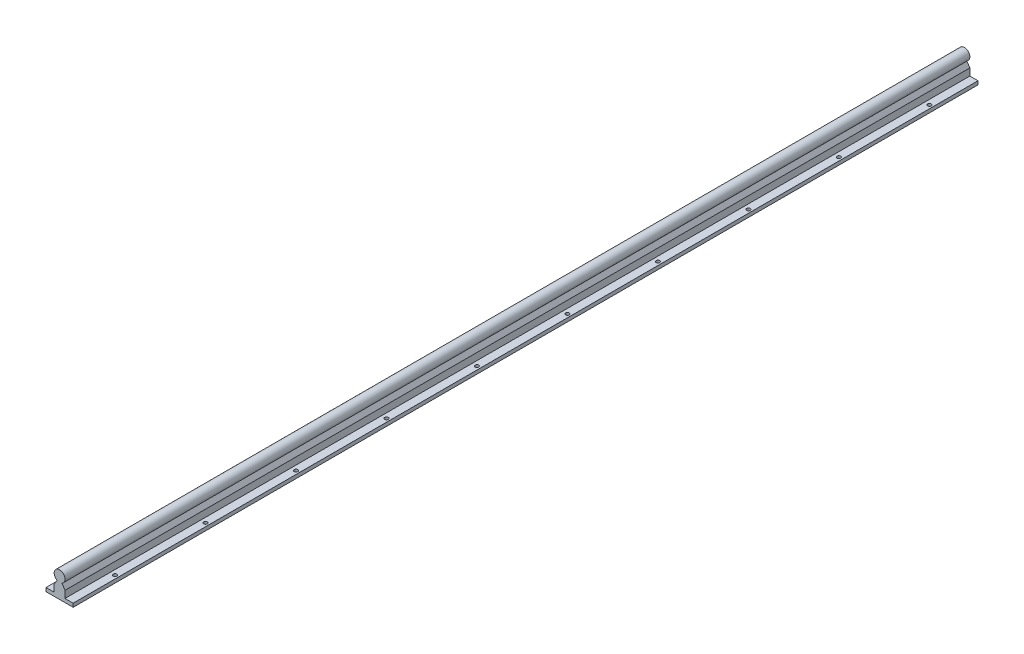
ISO-10303-21;
HEADER;
FILE_DESCRIPTION(('STEP AP214'),'2;1');
FILE_NAME('part.step','',(''),(''),'','','');
FILE_SCHEMA(('AUTOMOTIVE_DESIGN { 1 0 10303 214 1 1 1 1 }'));
ENDSEC;
DATA;
#1=APPLICATION_CONTEXT('core data for automotive mechanical design processes');
#2=APPLICATION_PROTOCOL_DEFINITION('international standard','automotive_design',2000,#1);
#3=PRODUCT_CONTEXT('',#1,'mechanical');
#4=PRODUCT('Part','Part','',(#3));
#5=PRODUCT_RELATED_PRODUCT_CATEGORY('part','',(#4));
#6=PRODUCT_DEFINITION_FORMATION('','',#4);
#7=PRODUCT_DEFINITION_CONTEXT('part definition',#1,'design');
#8=PRODUCT_DEFINITION('design','',#6,#7);
#9=PRODUCT_DEFINITION_SHAPE('','',#8);
#10=(LENGTH_UNIT() NAMED_UNIT(*) SI_UNIT(.MILLI.,.METRE.));
#11=(NAMED_UNIT(*) PLANE_ANGLE_UNIT() SI_UNIT($,.RADIAN.));
#12=(NAMED_UNIT(*) SI_UNIT($,.STERADIAN.) SOLID_ANGLE_UNIT());
#13=UNCERTAINTY_MEASURE_WITH_UNIT(LENGTH_MEASURE(1.E-05),#10,'distance_accuracy_value','');
#14=(GEOMETRIC_REPRESENTATION_CONTEXT(3) GLOBAL_UNCERTAINTY_ASSIGNED_CONTEXT((#13)) GLOBAL_UNIT_ASSIGNED_CONTEXT((#10,
#11,#12)) REPRESENTATION_CONTEXT('',''));
#15=CARTESIAN_POINT('',(0.,0.,0.));
#16=DIRECTION('',(0.,0.,1.));
#17=DIRECTION('',(1.,0.,0.));
#18=AXIS2_PLACEMENT_3D('',#15,#16,#17);
#19=CARTESIAN_POINT('',(19.7074577548358,0.,1000.));
#20=DIRECTION('',(-1.,0.,0.));
#21=DIRECTION('',(0.,-1.,0.));
#22=AXIS2_PLACEMENT_3D('',#19,#20,#21);
#23=PLANE('',#22);
#24=DIRECTION('',(0.,1.,0.));
#25=VECTOR('',#24,1.);
#26=CARTESIAN_POINT('',(19.7074577548358,0.,0.));
#27=LINE('',#26,#25);
#28=CARTESIAN_POINT('',(19.7074577548358,0.,0.));
#29=VERTEX_POINT('',#28);
#30=CARTESIAN_POINT('',(19.7074577548358,4.,0.));
#31=VERTEX_POINT('',#30);
#32=EDGE_CURVE('E140',#29,#31,#27,.T.);
#33=ORIENTED_EDGE('',*,*,#32,.T.);
#34=DIRECTION('',(0.,0.,-1.));
#35=VECTOR('',#34,1.);
#36=CARTESIAN_POINT('',(19.7074577548358,4.,1000.));
#37=LINE('',#36,#35);
#38=CARTESIAN_POINT('',(19.7074577548358,4.,1000.));
#39=VERTEX_POINT('',#38);
#40=EDGE_CURVE('E11',#39,#31,#37,.T.);
#41=ORIENTED_EDGE('',*,*,#40,.F.);
#42=DIRECTION('',(0.,1.,0.));
#43=VECTOR('',#42,1.);
#44=CARTESIAN_POINT('',(19.7074577548358,0.,1000.));
#45=LINE('',#44,#43);
#46=CARTESIAN_POINT('',(19.7074577548358,0.,1000.));
#47=VERTEX_POINT('',#46);
#48=EDGE_CURVE('E159',#47,#39,#45,.T.);
#49=ORIENTED_EDGE('',*,*,#48,.F.);
#50=DIRECTION('',(0.,0.,-1.));
#51=VECTOR('',#50,1.);
#52=CARTESIAN_POINT('',(19.7074577548358,0.,1000.));
#53=LINE('',#52,#51);
#54=EDGE_CURVE('E136',#47,#29,#53,.T.);
#55=ORIENTED_EDGE('',*,*,#54,.T.);
#56=EDGE_LOOP('',(#33,#41,#49,#55));
#57=FACE_BOUND('',#56,.T.);
#58=ADVANCED_FACE('F32',(#57),#23,.F.);
#59=CARTESIAN_POINT('',(19.7074577548358,4.,1000.));
#60=DIRECTION('',(0.,-1.,0.));
#61=DIRECTION('',(1.,0.,0.));
#62=AXIS2_PLACEMENT_3D('',#59,#60,#61);
#63=PLANE('',#62);
#64=CARTESIAN_POINT('',(15.9574577548358,3.99999999999999,950.));
#65=DIRECTION('',(0.,1.,0.));
#66=DIRECTION('',(-1.,0.,0.));
#67=AXIS2_PLACEMENT_3D('',#64,#65,#66);
#68=CIRCLE('',#67,2.);
#69=CARTESIAN_POINT('',(13.9574577548358,3.99999999999999,950.));
#70=VERTEX_POINT('',#69);
#71=EDGE_CURVE('E322',#70,#70,#68,.T.);
#72=ORIENTED_EDGE('',*,*,#71,.F.);
#73=EDGE_LOOP('',(#72));
#74=FACE_BOUND('',#73,.T.);
#75=CARTESIAN_POINT('',(15.9574577548358,3.99999999999999,850.));
#76=DIRECTION('',(0.,1.,0.));
#77=DIRECTION('',(-1.,0.,0.));
#78=AXIS2_PLACEMENT_3D('',#75,#76,#77);
#79=CIRCLE('',#78,2.);
#80=CARTESIAN_POINT('',(13.9574577548358,3.99999999999999,850.));
#81=VERTEX_POINT('',#80);
#82=EDGE_CURVE('E316',#81,#81,#79,.T.);
#83=ORIENTED_EDGE('',*,*,#82,.F.);
#84=EDGE_LOOP('',(#83));
#85=FACE_BOUND('',#84,.T.);
#86=CARTESIAN_POINT('',(15.9574577548358,3.99999999999999,750.));
#87=DIRECTION('',(0.,1.,0.));
#88=DIRECTION('',(-1.,0.,0.));
#89=AXIS2_PLACEMENT_3D('',#86,#87,#88);
#90=CIRCLE('',#89,2.);
#91=CARTESIAN_POINT('',(13.9574577548358,3.99999999999999,750.));
#92=VERTEX_POINT('',#91);
#93=EDGE_CURVE('E310',#92,#92,#90,.T.);
#94=ORIENTED_EDGE('',*,*,#93,.F.);
#95=EDGE_LOOP('',(#94));
#96=FACE_BOUND('',#95,.T.);
#97=CARTESIAN_POINT('',(15.9574577548358,3.99999999999999,650.));
#98=DIRECTION('',(0.,1.,0.));
#99=DIRECTION('',(-1.,0.,0.));
#100=AXIS2_PLACEMENT_3D('',#97,#98,#99);
#101=CIRCLE('',#100,2.);
#102=CARTESIAN_POINT('',(13.9574577548358,3.99999999999999,650.));
#103=VERTEX_POINT('',#102);
#104=EDGE_CURVE('E304',#103,#103,#101,.T.);
#105=ORIENTED_EDGE('',*,*,#104,.F.);
#106=EDGE_LOOP('',(#105));
#107=FACE_BOUND('',#106,.T.);
#108=CARTESIAN_POINT('',(15.9574577548358,3.99999999999999,550.));
#109=DIRECTION('',(0.,1.,0.));
#110=DIRECTION('',(-1.,0.,0.));
#111=AXIS2_PLACEMENT_3D('',#108,#109,#110);
#112=CIRCLE('',#111,2.);
#113=CARTESIAN_POINT('',(13.9574577548358,3.99999999999999,550.));
#114=VERTEX_POINT('',#113);
#115=EDGE_CURVE('E298',#114,#114,#112,.T.);
#116=ORIENTED_EDGE('',*,*,#115,.F.);
#117=EDGE_LOOP('',(#116));
#118=FACE_BOUND('',#117,.T.);
#119=CARTESIAN_POINT('',(15.9574577548358,3.99999999999999,450.));
#120=DIRECTION('',(0.,1.,0.));
#121=DIRECTION('',(-1.,0.,0.));
#122=AXIS2_PLACEMENT_3D('',#119,#120,#121);
#123=CIRCLE('',#122,2.);
#124=CARTESIAN_POINT('',(13.9574577548358,3.99999999999999,450.));
#125=VERTEX_POINT('',#124);
#126=EDGE_CURVE('E292',#125,#125,#123,.T.);
#127=ORIENTED_EDGE('',*,*,#126,.F.);
#128=EDGE_LOOP('',(#127));
#129=FACE_BOUND('',#128,.T.);
#130=CARTESIAN_POINT('',(15.9574577548358,3.99999999999999,350.));
#131=DIRECTION('',(0.,1.,0.));
#132=DIRECTION('',(-1.,0.,0.));
#133=AXIS2_PLACEMENT_3D('',#130,#131,#132);
#134=CIRCLE('',#133,2.);
#135=CARTESIAN_POINT('',(13.9574577548358,3.99999999999999,350.));
#136=VERTEX_POINT('',#135);
#137=EDGE_CURVE('E286',#136,#136,#134,.T.);
#138=ORIENTED_EDGE('',*,*,#137,.F.);
#139=EDGE_LOOP('',(#138));
#140=FACE_BOUND('',#139,.T.);
#141=CARTESIAN_POINT('',(15.9574577548358,3.99999999999999,250.));
#142=DIRECTION('',(0.,1.,0.));
#143=DIRECTION('',(-1.,0.,0.));
#144=AXIS2_PLACEMENT_3D('',#141,#142,#143);
#145=CIRCLE('',#144,2.);
#146=CARTESIAN_POINT('',(13.9574577548358,3.99999999999999,250.));
#147=VERTEX_POINT('',#146);
#148=EDGE_CURVE('E280',#147,#147,#145,.T.);
#149=ORIENTED_EDGE('',*,*,#148,.F.);
#150=EDGE_LOOP('',(#149));
#151=FACE_BOUND('',#150,.T.);
#152=CARTESIAN_POINT('',(15.9574577548358,3.99999999999999,150.));
#153=DIRECTION('',(0.,1.,0.));
#154=DIRECTION('',(-1.,0.,0.));
#155=AXIS2_PLACEMENT_3D('',#152,#153,#154);
#156=CIRCLE('',#155,2.);
#157=CARTESIAN_POINT('',(13.9574577548358,3.99999999999999,150.));
#158=VERTEX_POINT('',#157);
#159=EDGE_CURVE('E274',#158,#158,#156,.T.);
#160=ORIENTED_EDGE('',*,*,#159,.F.);
#161=EDGE_LOOP('',(#160));
#162=FACE_BOUND('',#161,.T.);
#163=CARTESIAN_POINT('',(15.9574577548358,3.99999999999999,50.));
#164=DIRECTION('',(0.,1.,0.));
#165=DIRECTION('',(-1.,0.,0.));
#166=AXIS2_PLACEMENT_3D('',#163,#164,#165);
#167=CIRCLE('',#166,2.);
#168=CARTESIAN_POINT('',(13.9574577548358,3.99999999999999,50.));
#169=VERTEX_POINT('',#168);
#170=EDGE_CURVE('E268',#169,#169,#167,.T.);
#171=ORIENTED_EDGE('',*,*,#170,.F.);
#172=EDGE_LOOP('',(#171));
#173=FACE_BOUND('',#172,.T.);
#174=DIRECTION('',(-1.,0.,0.));
#175=VECTOR('',#174,1.);
#176=CARTESIAN_POINT('',(19.7074577548358,4.,0.));
#177=LINE('',#176,#175);
#178=CARTESIAN_POINT('',(10.7074577548358,4.,0.));
#179=VERTEX_POINT('',#178);
#180=EDGE_CURVE('E143',#31,#179,#177,.T.);
#181=ORIENTED_EDGE('',*,*,#180,.T.);
#182=DIRECTION('',(0.,0.,-1.));
#183=VECTOR('',#182,1.);
#184=CARTESIAN_POINT('',(10.7074577548358,4.,1000.));
#185=LINE('',#184,#183);
#186=CARTESIAN_POINT('',(10.7074577548358,4.,1000.));
#187=VERTEX_POINT('',#186);
#188=EDGE_CURVE('E40',#187,#179,#185,.T.);
#189=ORIENTED_EDGE('',*,*,#188,.F.);
#190=DIRECTION('',(-1.,0.,0.));
#191=VECTOR('',#190,1.);
#192=CARTESIAN_POINT('',(19.7074577548358,4.,1000.));
#193=LINE('',#192,#191);
#194=EDGE_CURVE('E97',#39,#187,#193,.T.);
#195=ORIENTED_EDGE('',*,*,#194,.F.);
#196=ORIENTED_EDGE('',*,*,#40,.T.);
#197=EDGE_LOOP('',(#181,#189,#195,#196));
#198=FACE_BOUND('',#197,.T.);
#199=ADVANCED_FACE('F329',(#74,#85,#96,#107,#118,#129,#140,#151,#162,#173,#198),#63,.F.);
#200=CARTESIAN_POINT('',(10.7074577548358,4.,1000.));
#201=DIRECTION('',(-1.,0.,0.));
#202=DIRECTION('',(0.,0.,1.));
#203=AXIS2_PLACEMENT_3D('',#200,#201,#202);
#204=PLANE('',#203);
#205=DIRECTION('',(0.,1.,0.));
#206=VECTOR('',#205,1.);
#207=CARTESIAN_POINT('',(10.7074577548358,4.,0.));
#208=LINE('',#207,#206);
#209=CARTESIAN_POINT('',(10.7074577548358,11.8,0.));
#210=VERTEX_POINT('',#209);
#211=EDGE_CURVE('E146',#179,#210,#208,.T.);
#212=ORIENTED_EDGE('',*,*,#211,.T.);
#213=DIRECTION('',(0.,0.,-1.));
#214=VECTOR('',#213,1.);
#215=CARTESIAN_POINT('',(10.7074577548358,11.8,1000.));
#216=LINE('',#215,#214);
#217=CARTESIAN_POINT('',(10.7074577548358,11.8,1000.));
#218=VERTEX_POINT('',#217);
#219=EDGE_CURVE('E172',#218,#210,#216,.T.);
#220=ORIENTED_EDGE('',*,*,#219,.F.);
#221=DIRECTION('',(0.,1.,0.));
#222=VECTOR('',#221,1.);
#223=CARTESIAN_POINT('',(10.7074577548358,4.,1000.));
#224=LINE('',#223,#222);
#225=EDGE_CURVE('E180',#187,#218,#224,.T.);
#226=ORIENTED_EDGE('',*,*,#225,.F.);
#227=ORIENTED_EDGE('',*,*,#188,.T.);
#228=EDGE_LOOP('',(#212,#220,#226,#227));
#229=FACE_BOUND('',#228,.T.);
#230=ADVANCED_FACE('F178',(#229),#204,.F.);
#231=CARTESIAN_POINT('',(7.30745775483578,17.,1000.));
#232=DIRECTION('',(-0.836969613973546,-0.547249362982703,0.));
#233=DIRECTION('',(0.547249362982703,-0.836969613973546,0.));
#234=AXIS2_PLACEMENT_3D('',#231,#232,#233);
#235=PLANE('',#234);
#236=DIRECTION('',(-0.547249362982703,0.836969613973546,0.));
#237=VECTOR('',#236,1.);
#238=CARTESIAN_POINT('',(7.30745775483578,17.,0.));
#239=LINE('',#238,#237);
#240=CARTESIAN_POINT('',(7.30745775483578,17.,0.));
#241=VERTEX_POINT('',#240);
#242=EDGE_CURVE('E148',#210,#241,#239,.T.);
#243=ORIENTED_EDGE('',*,*,#242,.T.);
#244=DIRECTION('',(0.,0.,-1.));
#245=VECTOR('',#244,1.);
#246=CARTESIAN_POINT('',(7.30745775483578,17.,1000.));
#247=LINE('',#246,#245);
#248=CARTESIAN_POINT('',(7.30745775483578,17.,1000.));
#249=VERTEX_POINT('',#248);
#250=EDGE_CURVE('E169',#249,#241,#247,.T.);
#251=ORIENTED_EDGE('',*,*,#250,.F.);
#252=DIRECTION('',(-0.547249362982703,0.836969613973546,0.));
#253=VECTOR('',#252,1.);
#254=CARTESIAN_POINT('',(7.30745775483578,17.,1000.));
#255=LINE('',#254,#253);
#256=EDGE_CURVE('E198',#218,#249,#255,.T.);
#257=ORIENTED_EDGE('',*,*,#256,.F.);
#258=ORIENTED_EDGE('',*,*,#219,.T.);
#259=EDGE_LOOP('',(#243,#251,#257,#258));
#260=FACE_BOUND('',#259,.T.);
#261=ADVANCED_FACE('F189',(#260),#235,.F.);
#262=CARTESIAN_POINT('',(4.70745775483578,22.4074023338383,1000.));
#263=DIRECTION('',(0.,0.,-1.));
#264=DIRECTION('',(-1.,0.,0.));
#265=AXIS2_PLACEMENT_3D('',#262,#263,#264);
#266=CYLINDRICAL_SURFACE('',#265,6.);
#267=CARTESIAN_POINT('',(4.70745775483578,22.4074023338383,0.));
#268=DIRECTION('',(0.,0.,1.));
#269=DIRECTION('',(1.,0.,0.));
#270=AXIS2_PLACEMENT_3D('',#267,#268,#269);
#271=CIRCLE('',#270,6.);
#272=CARTESIAN_POINT('',(2.10745775483578,17.,0.));
#273=VERTEX_POINT('',#272);
#274=EDGE_CURVE('E150',#241,#273,#271,.T.);
#275=ORIENTED_EDGE('',*,*,#274,.T.);
#276=DIRECTION('',(0.,0.,-1.));
#277=VECTOR('',#276,1.);
#278=CARTESIAN_POINT('',(2.10745775483578,17.,1000.));
#279=LINE('',#278,#277);
#280=CARTESIAN_POINT('',(2.10745775483578,17.,1000.));
#281=VERTEX_POINT('',#280);
#282=EDGE_CURVE('E166',#281,#273,#279,.T.);
#283=ORIENTED_EDGE('',*,*,#282,.F.);
#284=CARTESIAN_POINT('',(4.70745775483578,22.4074023338383,1000.));
#285=DIRECTION('',(0.,0.,1.));
#286=DIRECTION('',(1.,0.,0.));
#287=AXIS2_PLACEMENT_3D('',#284,#285,#286);
#288=CIRCLE('',#287,6.);
#289=EDGE_CURVE('E195',#249,#281,#288,.T.);
#290=ORIENTED_EDGE('',*,*,#289,.F.);
#291=ORIENTED_EDGE('',*,*,#250,.T.);
#292=EDGE_LOOP('',(#275,#283,#290,#291));
#293=FACE_BOUND('',#292,.T.);
#294=ADVANCED_FACE('F193',(#293),#266,.T.);
#295=CARTESIAN_POINT('',(-1.29254224516422,11.8,1000.));
#296=DIRECTION('',(0.836969613973546,-0.547249362982703,0.));
#297=DIRECTION('',(0.547249362982703,0.836969613973546,0.));
#298=AXIS2_PLACEMENT_3D('',#295,#296,#297);
#299=PLANE('',#298);
#300=DIRECTION('',(-0.547249362982703,-0.836969613973546,0.));
#301=VECTOR('',#300,1.);
#302=CARTESIAN_POINT('',(-1.29254224516422,11.8,0.));
#303=LINE('',#302,#301);
#304=CARTESIAN_POINT('',(-1.29254224516422,11.8,0.));
#305=VERTEX_POINT('',#304);
#306=EDGE_CURVE('E152',#273,#305,#303,.T.);
#307=ORIENTED_EDGE('',*,*,#306,.T.);
#308=DIRECTION('',(0.,0.,-1.));
#309=VECTOR('',#308,1.);
#310=CARTESIAN_POINT('',(-1.29254224516422,11.8,1000.));
#311=LINE('',#310,#309);
#312=CARTESIAN_POINT('',(-1.29254224516422,11.8,1000.));
#313=VERTEX_POINT('',#312);
#314=EDGE_CURVE('E163',#313,#305,#311,.T.);
#315=ORIENTED_EDGE('',*,*,#314,.F.);
#316=DIRECTION('',(-0.547249362982703,-0.836969613973546,0.));
#317=VECTOR('',#316,1.);
#318=CARTESIAN_POINT('',(-1.29254224516422,11.8,1000.));
#319=LINE('',#318,#317);
#320=EDGE_CURVE('E197',#281,#313,#319,.T.);
#321=ORIENTED_EDGE('',*,*,#320,.F.);
#322=ORIENTED_EDGE('',*,*,#282,.T.);
#323=EDGE_LOOP('',(#307,#315,#321,#322));
#324=FACE_BOUND('',#323,.T.);
#325=ADVANCED_FACE('F357',(#324),#299,.F.);
#326=CARTESIAN_POINT('',(-1.29254224516422,4.,1000.));
#327=DIRECTION('',(1.,0.,0.));
#328=DIRECTION('',(0.,0.,-1.));
#329=AXIS2_PLACEMENT_3D('',#326,#327,#328);
#330=PLANE('',#329);
#331=DIRECTION('',(0.,-1.,0.));
#332=VECTOR('',#331,1.);
#333=CARTESIAN_POINT('',(-1.29254224516422,4.,0.));
#334=LINE('',#333,#332);
#335=CARTESIAN_POINT('',(-1.29254224516422,4.,0.));
#336=VERTEX_POINT('',#335);
#337=EDGE_CURVE('E154',#305,#336,#334,.T.);
#338=ORIENTED_EDGE('',*,*,#337,.T.);
#339=DIRECTION('',(0.,0.,-1.));
#340=VECTOR('',#339,1.);
#341=CARTESIAN_POINT('',(-1.29254224516422,4.,1000.));
#342=LINE('',#341,#340);
#343=CARTESIAN_POINT('',(-1.29254224516422,4.,1000.));
#344=VERTEX_POINT('',#343);
#345=EDGE_CURVE('E131',#344,#336,#342,.T.);
#346=ORIENTED_EDGE('',*,*,#345,.F.);
#347=DIRECTION('',(0.,-1.,0.));
#348=VECTOR('',#347,1.);
#349=CARTESIAN_POINT('',(-1.29254224516422,4.,1000.));
#350=LINE('',#349,#348);
#351=EDGE_CURVE('E122',#313,#344,#350,.T.);
#352=ORIENTED_EDGE('',*,*,#351,.F.);
#353=ORIENTED_EDGE('',*,*,#314,.T.);
#354=EDGE_LOOP('',(#338,#346,#352,#353));
#355=FACE_BOUND('',#354,.T.);
#356=ADVANCED_FACE('F354',(#355),#330,.F.);
#357=CARTESIAN_POINT('',(-10.2925422451642,4.,1000.));
#358=DIRECTION('',(0.,-1.,0.));
#359=DIRECTION('',(1.,0.,0.));
#360=AXIS2_PLACEMENT_3D('',#357,#358,#359);
#361=PLANE('',#360);
#362=CARTESIAN_POINT('',(-6.54254224516422,4.,950.));
#363=DIRECTION('',(0.,1.,0.));
#364=DIRECTION('',(-1.,0.,0.));
#365=AXIS2_PLACEMENT_3D('',#362,#363,#364);
#366=CIRCLE('',#365,2.);
#367=CARTESIAN_POINT('',(-8.54254224516422,4.,950.));
#368=VERTEX_POINT('',#367);
#369=EDGE_CURVE('E262',#368,#368,#366,.T.);
#370=ORIENTED_EDGE('',*,*,#369,.F.);
#371=EDGE_LOOP('',(#370));
#372=FACE_BOUND('',#371,.T.);
#373=CARTESIAN_POINT('',(-6.54254224516422,4.,850.));
#374=DIRECTION('',(0.,1.,0.));
#375=DIRECTION('',(-1.,0.,0.));
#376=AXIS2_PLACEMENT_3D('',#373,#374,#375);
#377=CIRCLE('',#376,2.);
#378=CARTESIAN_POINT('',(-8.54254224516422,4.,850.));
#379=VERTEX_POINT('',#378);
#380=EDGE_CURVE('E256',#379,#379,#377,.T.);
#381=ORIENTED_EDGE('',*,*,#380,.F.);
#382=EDGE_LOOP('',(#381));
#383=FACE_BOUND('',#382,.T.);
#384=CARTESIAN_POINT('',(-6.54254224516422,4.,750.));
#385=DIRECTION('',(0.,1.,0.));
#386=DIRECTION('',(-1.,0.,0.));
#387=AXIS2_PLACEMENT_3D('',#384,#385,#386);
#388=CIRCLE('',#387,2.);
#389=CARTESIAN_POINT('',(-8.54254224516422,4.,750.));
#390=VERTEX_POINT('',#389);
#391=EDGE_CURVE('E250',#390,#390,#388,.T.);
#392=ORIENTED_EDGE('',*,*,#391,.F.);
#393=EDGE_LOOP('',(#392));
#394=FACE_BOUND('',#393,.T.);
#395=CARTESIAN_POINT('',(-6.54254224516422,4.,650.));
#396=DIRECTION('',(0.,1.,0.));
#397=DIRECTION('',(-1.,0.,0.));
#398=AXIS2_PLACEMENT_3D('',#395,#396,#397);
#399=CIRCLE('',#398,2.);
#400=CARTESIAN_POINT('',(-8.54254224516422,4.,650.));
#401=VERTEX_POINT('',#400);
#402=EDGE_CURVE('E244',#401,#401,#399,.T.);
#403=ORIENTED_EDGE('',*,*,#402,.F.);
#404=EDGE_LOOP('',(#403));
#405=FACE_BOUND('',#404,.T.);
#406=CARTESIAN_POINT('',(-6.54254224516422,4.,550.));
#407=DIRECTION('',(0.,1.,0.));
#408=DIRECTION('',(-1.,0.,0.));
#409=AXIS2_PLACEMENT_3D('',#406,#407,#408);
#410=CIRCLE('',#409,2.);
#411=CARTESIAN_POINT('',(-8.54254224516422,4.,550.));
#412=VERTEX_POINT('',#411);
#413=EDGE_CURVE('E238',#412,#412,#410,.T.);
#414=ORIENTED_EDGE('',*,*,#413,.F.);
#415=EDGE_LOOP('',(#414));
#416=FACE_BOUND('',#415,.T.);
#417=CARTESIAN_POINT('',(-6.54254224516422,4.,450.));
#418=DIRECTION('',(0.,1.,0.));
#419=DIRECTION('',(-1.,0.,0.));
#420=AXIS2_PLACEMENT_3D('',#417,#418,#419);
#421=CIRCLE('',#420,2.);
#422=CARTESIAN_POINT('',(-8.54254224516422,4.,450.));
#423=VERTEX_POINT('',#422);
#424=EDGE_CURVE('E232',#423,#423,#421,.T.);
#425=ORIENTED_EDGE('',*,*,#424,.F.);
#426=EDGE_LOOP('',(#425));
#427=FACE_BOUND('',#426,.T.);
#428=CARTESIAN_POINT('',(-6.54254224516422,4.,350.));
#429=DIRECTION('',(0.,1.,0.));
#430=DIRECTION('',(-1.,0.,0.));
#431=AXIS2_PLACEMENT_3D('',#428,#429,#430);
#432=CIRCLE('',#431,2.);
#433=CARTESIAN_POINT('',(-8.54254224516422,4.,350.));
#434=VERTEX_POINT('',#433);
#435=EDGE_CURVE('E226',#434,#434,#432,.T.);
#436=ORIENTED_EDGE('',*,*,#435,.F.);
#437=EDGE_LOOP('',(#436));
#438=FACE_BOUND('',#437,.T.);
#439=CARTESIAN_POINT('',(-6.54254224516422,4.,250.));
#440=DIRECTION('',(0.,1.,0.));
#441=DIRECTION('',(-1.,0.,0.));
#442=AXIS2_PLACEMENT_3D('',#439,#440,#441);
#443=CIRCLE('',#442,2.);
#444=CARTESIAN_POINT('',(-8.54254224516422,4.,250.));
#445=VERTEX_POINT('',#444);
#446=EDGE_CURVE('E220',#445,#445,#443,.T.);
#447=ORIENTED_EDGE('',*,*,#446,.F.);
#448=EDGE_LOOP('',(#447));
#449=FACE_BOUND('',#448,.T.);
#450=CARTESIAN_POINT('',(-6.54254224516422,4.,150.));
#451=DIRECTION('',(0.,1.,0.));
#452=DIRECTION('',(-1.,0.,0.));
#453=AXIS2_PLACEMENT_3D('',#450,#451,#452);
#454=CIRCLE('',#453,2.);
#455=CARTESIAN_POINT('',(-8.54254224516422,4.,150.));
#456=VERTEX_POINT('',#455);
#457=EDGE_CURVE('E214',#456,#456,#454,.T.);
#458=ORIENTED_EDGE('',*,*,#457,.F.);
#459=EDGE_LOOP('',(#458));
#460=FACE_BOUND('',#459,.T.);
#461=CARTESIAN_POINT('',(-6.54254224516422,4.,50.));
#462=DIRECTION('',(0.,1.,0.));
#463=DIRECTION('',(-1.,0.,0.));
#464=AXIS2_PLACEMENT_3D('',#461,#462,#463);
#465=CIRCLE('',#464,2.);
#466=CARTESIAN_POINT('',(-8.54254224516422,4.,50.));
#467=VERTEX_POINT('',#466);
#468=EDGE_CURVE('E208',#467,#467,#465,.T.);
#469=ORIENTED_EDGE('',*,*,#468,.F.);
#470=EDGE_LOOP('',(#469));
#471=FACE_BOUND('',#470,.T.);
#472=DIRECTION('',(-1.,0.,0.));
#473=VECTOR('',#472,1.);
#474=CARTESIAN_POINT('',(-10.2925422451642,4.,0.));
#475=LINE('',#474,#473);
#476=CARTESIAN_POINT('',(-10.2925422451642,4.,0.));
#477=VERTEX_POINT('',#476);
#478=EDGE_CURVE('E130',#336,#477,#475,.T.);
#479=ORIENTED_EDGE('',*,*,#478,.T.);
#480=DIRECTION('',(0.,0.,-1.));
#481=VECTOR('',#480,1.);
#482=CARTESIAN_POINT('',(-10.2925422451642,4.,1000.));
#483=LINE('',#482,#481);
#484=CARTESIAN_POINT('',(-10.2925422451642,4.,1000.));
#485=VERTEX_POINT('',#484);
#486=EDGE_CURVE('E127',#485,#477,#483,.T.);
#487=ORIENTED_EDGE('',*,*,#486,.F.);
#488=DIRECTION('',(-1.,0.,0.));
#489=VECTOR('',#488,1.);
#490=CARTESIAN_POINT('',(-10.2925422451642,4.,1000.));
#491=LINE('',#490,#489);
#492=EDGE_CURVE('E116',#344,#485,#491,.T.);
#493=ORIENTED_EDGE('',*,*,#492,.F.);
#494=ORIENTED_EDGE('',*,*,#345,.T.);
#495=EDGE_LOOP('',(#479,#487,#493,#494));
#496=FACE_BOUND('',#495,.T.);
#497=ADVANCED_FACE('F128',(#372,#383,#394,#405,#416,#427,#438,#449,#460,#471,#496),#361,.F.);
#498=CARTESIAN_POINT('',(-10.2925422451642,0.,1000.));
#499=DIRECTION('',(1.,0.,0.));
#500=DIRECTION('',(0.,1.,0.));
#501=AXIS2_PLACEMENT_3D('',#498,#499,#500);
#502=PLANE('',#501);
#503=DIRECTION('',(0.,-1.,0.));
#504=VECTOR('',#503,1.);
#505=CARTESIAN_POINT('',(-10.2925422451642,0.,0.));
#506=LINE('',#505,#504);
#507=CARTESIAN_POINT('',(-10.2925422451642,0.,0.));
#508=VERTEX_POINT('',#507);
#509=EDGE_CURVE('E83',#477,#508,#506,.T.);
#510=ORIENTED_EDGE('',*,*,#509,.T.);
#511=DIRECTION('',(0.,0.,-1.));
#512=VECTOR('',#511,1.);
#513=CARTESIAN_POINT('',(-10.2925422451642,0.,1000.));
#514=LINE('',#513,#512);
#515=CARTESIAN_POINT('',(-10.2925422451642,0.,1000.));
#516=VERTEX_POINT('',#515);
#517=EDGE_CURVE('E132',#516,#508,#514,.T.);
#518=ORIENTED_EDGE('',*,*,#517,.F.);
#519=DIRECTION('',(0.,-1.,0.));
#520=VECTOR('',#519,1.);
#521=CARTESIAN_POINT('',(-10.2925422451642,0.,1000.));
#522=LINE('',#521,#520);
#523=EDGE_CURVE('E120',#485,#516,#522,.T.);
#524=ORIENTED_EDGE('',*,*,#523,.F.);
#525=ORIENTED_EDGE('',*,*,#486,.T.);
#526=EDGE_LOOP('',(#510,#518,#524,#525));
#527=FACE_BOUND('',#526,.T.);
#528=ADVANCED_FACE('F134',(#527),#502,.F.);
#529=CARTESIAN_POINT('',(19.7074577548358,0.,1000.));
#530=DIRECTION('',(0.,1.,0.));
#531=DIRECTION('',(0.,0.,1.));
#532=AXIS2_PLACEMENT_3D('',#529,#530,#531);
#533=PLANE('',#532);
#534=CARTESIAN_POINT('',(15.9574577548358,0.,950.));
#535=DIRECTION('',(0.,1.,0.));
#536=DIRECTION('',(0.,0.,1.));
#537=AXIS2_PLACEMENT_3D('',#534,#535,#536);
#538=CIRCLE('',#537,2.);
#539=CARTESIAN_POINT('',(15.9574577548358,0.,952.));
#540=VERTEX_POINT('',#539);
#541=EDGE_CURVE('E319',#540,#540,#538,.F.);
#542=ORIENTED_EDGE('',*,*,#541,.F.);
#543=EDGE_LOOP('',(#542));
#544=FACE_BOUND('',#543,.T.);
#545=CARTESIAN_POINT('',(15.9574577548358,0.,850.));
#546=DIRECTION('',(0.,1.,0.));
#547=DIRECTION('',(0.,0.,1.));
#548=AXIS2_PLACEMENT_3D('',#545,#546,#547);
#549=CIRCLE('',#548,2.);
#550=CARTESIAN_POINT('',(15.9574577548358,0.,852.));
#551=VERTEX_POINT('',#550);
#552=EDGE_CURVE('E313',#551,#551,#549,.F.);
#553=ORIENTED_EDGE('',*,*,#552,.F.);
#554=EDGE_LOOP('',(#553));
#555=FACE_BOUND('',#554,.T.);
#556=CARTESIAN_POINT('',(15.9574577548358,0.,750.));
#557=DIRECTION('',(0.,1.,0.));
#558=DIRECTION('',(0.,0.,1.));
#559=AXIS2_PLACEMENT_3D('',#556,#557,#558);
#560=CIRCLE('',#559,2.);
#561=CARTESIAN_POINT('',(15.9574577548358,0.,752.));
#562=VERTEX_POINT('',#561);
#563=EDGE_CURVE('E307',#562,#562,#560,.F.);
#564=ORIENTED_EDGE('',*,*,#563,.F.);
#565=EDGE_LOOP('',(#564));
#566=FACE_BOUND('',#565,.T.);
#567=CARTESIAN_POINT('',(15.9574577548358,0.,650.));
#568=DIRECTION('',(0.,1.,0.));
#569=DIRECTION('',(0.,0.,1.));
#570=AXIS2_PLACEMENT_3D('',#567,#568,#569);
#571=CIRCLE('',#570,2.);
#572=CARTESIAN_POINT('',(15.9574577548358,0.,652.));
#573=VERTEX_POINT('',#572);
#574=EDGE_CURVE('E301',#573,#573,#571,.F.);
#575=ORIENTED_EDGE('',*,*,#574,.F.);
#576=EDGE_LOOP('',(#575));
#577=FACE_BOUND('',#576,.T.);
#578=CARTESIAN_POINT('',(15.9574577548358,0.,550.));
#579=DIRECTION('',(0.,1.,0.));
#580=DIRECTION('',(0.,0.,1.));
#581=AXIS2_PLACEMENT_3D('',#578,#579,#580);
#582=CIRCLE('',#581,2.);
#583=CARTESIAN_POINT('',(15.9574577548358,0.,552.));
#584=VERTEX_POINT('',#583);
#585=EDGE_CURVE('E295',#584,#584,#582,.F.);
#586=ORIENTED_EDGE('',*,*,#585,.F.);
#587=EDGE_LOOP('',(#586));
#588=FACE_BOUND('',#587,.T.);
#589=CARTESIAN_POINT('',(15.9574577548358,0.,450.));
#590=DIRECTION('',(0.,1.,0.));
#591=DIRECTION('',(0.,0.,1.));
#592=AXIS2_PLACEMENT_3D('',#589,#590,#591);
#593=CIRCLE('',#592,2.);
#594=CARTESIAN_POINT('',(15.9574577548358,0.,452.));
#595=VERTEX_POINT('',#594);
#596=EDGE_CURVE('E289',#595,#595,#593,.F.);
#597=ORIENTED_EDGE('',*,*,#596,.F.);
#598=EDGE_LOOP('',(#597));
#599=FACE_BOUND('',#598,.T.);
#600=CARTESIAN_POINT('',(15.9574577548358,0.,350.));
#601=DIRECTION('',(0.,1.,0.));
#602=DIRECTION('',(0.,0.,1.));
#603=AXIS2_PLACEMENT_3D('',#600,#601,#602);
#604=CIRCLE('',#603,2.);
#605=CARTESIAN_POINT('',(15.9574577548358,0.,352.));
#606=VERTEX_POINT('',#605);
#607=EDGE_CURVE('E283',#606,#606,#604,.F.);
#608=ORIENTED_EDGE('',*,*,#607,.F.);
#609=EDGE_LOOP('',(#608));
#610=FACE_BOUND('',#609,.T.);
#611=CARTESIAN_POINT('',(15.9574577548358,0.,250.));
#612=DIRECTION('',(0.,1.,0.));
#613=DIRECTION('',(0.,0.,1.));
#614=AXIS2_PLACEMENT_3D('',#611,#612,#613);
#615=CIRCLE('',#614,2.);
#616=CARTESIAN_POINT('',(15.9574577548358,0.,252.));
#617=VERTEX_POINT('',#616);
#618=EDGE_CURVE('E277',#617,#617,#615,.F.);
#619=ORIENTED_EDGE('',*,*,#618,.F.);
#620=EDGE_LOOP('',(#619));
#621=FACE_BOUND('',#620,.T.);
#622=CARTESIAN_POINT('',(15.9574577548358,0.,150.));
#623=DIRECTION('',(0.,1.,0.));
#624=DIRECTION('',(0.,0.,1.));
#625=AXIS2_PLACEMENT_3D('',#622,#623,#624);
#626=CIRCLE('',#625,2.);
#627=CARTESIAN_POINT('',(15.9574577548358,0.,152.));
#628=VERTEX_POINT('',#627);
#629=EDGE_CURVE('E271',#628,#628,#626,.F.);
#630=ORIENTED_EDGE('',*,*,#629,.F.);
#631=EDGE_LOOP('',(#630));
#632=FACE_BOUND('',#631,.T.);
#633=CARTESIAN_POINT('',(15.9574577548358,0.,50.));
#634=DIRECTION('',(0.,1.,0.));
#635=DIRECTION('',(0.,0.,1.));
#636=AXIS2_PLACEMENT_3D('',#633,#634,#635);
#637=CIRCLE('',#636,2.);
#638=CARTESIAN_POINT('',(15.9574577548358,0.,52.));
#639=VERTEX_POINT('',#638);
#640=EDGE_CURVE('E265',#639,#639,#637,.F.);
#641=ORIENTED_EDGE('',*,*,#640,.F.);
#642=EDGE_LOOP('',(#641));
#643=FACE_BOUND('',#642,.T.);
#644=CARTESIAN_POINT('',(-6.54254224516422,0.,950.));
#645=DIRECTION('',(0.,1.,0.));
#646=DIRECTION('',(0.,0.,1.));
#647=AXIS2_PLACEMENT_3D('',#644,#645,#646);
#648=CIRCLE('',#647,2.);
#649=CARTESIAN_POINT('',(-6.54254224516422,0.,952.));
#650=VERTEX_POINT('',#649);
#651=EDGE_CURVE('E259',#650,#650,#648,.F.);
#652=ORIENTED_EDGE('',*,*,#651,.F.);
#653=EDGE_LOOP('',(#652));
#654=FACE_BOUND('',#653,.T.);
#655=CARTESIAN_POINT('',(-6.54254224516422,0.,850.));
#656=DIRECTION('',(0.,1.,0.));
#657=DIRECTION('',(0.,0.,1.));
#658=AXIS2_PLACEMENT_3D('',#655,#656,#657);
#659=CIRCLE('',#658,2.);
#660=CARTESIAN_POINT('',(-6.54254224516422,0.,852.));
#661=VERTEX_POINT('',#660);
#662=EDGE_CURVE('E253',#661,#661,#659,.F.);
#663=ORIENTED_EDGE('',*,*,#662,.F.);
#664=EDGE_LOOP('',(#663));
#665=FACE_BOUND('',#664,.T.);
#666=CARTESIAN_POINT('',(-6.54254224516422,0.,750.));
#667=DIRECTION('',(0.,1.,0.));
#668=DIRECTION('',(0.,0.,1.));
#669=AXIS2_PLACEMENT_3D('',#666,#667,#668);
#670=CIRCLE('',#669,2.);
#671=CARTESIAN_POINT('',(-6.54254224516422,0.,752.));
#672=VERTEX_POINT('',#671);
#673=EDGE_CURVE('E247',#672,#672,#670,.F.);
#674=ORIENTED_EDGE('',*,*,#673,.F.);
#675=EDGE_LOOP('',(#674));
#676=FACE_BOUND('',#675,.T.);
#677=CARTESIAN_POINT('',(-6.54254224516422,0.,650.));
#678=DIRECTION('',(0.,1.,0.));
#679=DIRECTION('',(0.,0.,1.));
#680=AXIS2_PLACEMENT_3D('',#677,#678,#679);
#681=CIRCLE('',#680,2.);
#682=CARTESIAN_POINT('',(-6.54254224516422,0.,652.));
#683=VERTEX_POINT('',#682);
#684=EDGE_CURVE('E241',#683,#683,#681,.F.);
#685=ORIENTED_EDGE('',*,*,#684,.F.);
#686=EDGE_LOOP('',(#685));
#687=FACE_BOUND('',#686,.T.);
#688=CARTESIAN_POINT('',(-6.54254224516422,0.,550.));
#689=DIRECTION('',(0.,1.,0.));
#690=DIRECTION('',(0.,0.,1.));
#691=AXIS2_PLACEMENT_3D('',#688,#689,#690);
#692=CIRCLE('',#691,2.);
#693=CARTESIAN_POINT('',(-6.54254224516422,0.,552.));
#694=VERTEX_POINT('',#693);
#695=EDGE_CURVE('E235',#694,#694,#692,.F.);
#696=ORIENTED_EDGE('',*,*,#695,.F.);
#697=EDGE_LOOP('',(#696));
#698=FACE_BOUND('',#697,.T.);
#699=CARTESIAN_POINT('',(-6.54254224516422,0.,450.));
#700=DIRECTION('',(0.,1.,0.));
#701=DIRECTION('',(0.,0.,1.));
#702=AXIS2_PLACEMENT_3D('',#699,#700,#701);
#703=CIRCLE('',#702,2.);
#704=CARTESIAN_POINT('',(-6.54254224516422,0.,452.));
#705=VERTEX_POINT('',#704);
#706=EDGE_CURVE('E229',#705,#705,#703,.F.);
#707=ORIENTED_EDGE('',*,*,#706,.F.);
#708=EDGE_LOOP('',(#707));
#709=FACE_BOUND('',#708,.T.);
#710=CARTESIAN_POINT('',(-6.54254224516422,0.,350.));
#711=DIRECTION('',(0.,1.,0.));
#712=DIRECTION('',(0.,0.,1.));
#713=AXIS2_PLACEMENT_3D('',#710,#711,#712);
#714=CIRCLE('',#713,2.);
#715=CARTESIAN_POINT('',(-6.54254224516422,0.,352.));
#716=VERTEX_POINT('',#715);
#717=EDGE_CURVE('E223',#716,#716,#714,.F.);
#718=ORIENTED_EDGE('',*,*,#717,.F.);
#719=EDGE_LOOP('',(#718));
#720=FACE_BOUND('',#719,.T.);
#721=CARTESIAN_POINT('',(-6.54254224516422,0.,250.));
#722=DIRECTION('',(0.,1.,0.));
#723=DIRECTION('',(0.,0.,1.));
#724=AXIS2_PLACEMENT_3D('',#721,#722,#723);
#725=CIRCLE('',#724,2.);
#726=CARTESIAN_POINT('',(-6.54254224516422,0.,252.));
#727=VERTEX_POINT('',#726);
#728=EDGE_CURVE('E217',#727,#727,#725,.F.);
#729=ORIENTED_EDGE('',*,*,#728,.F.);
#730=EDGE_LOOP('',(#729));
#731=FACE_BOUND('',#730,.T.);
#732=CARTESIAN_POINT('',(-6.54254224516422,0.,150.));
#733=DIRECTION('',(0.,1.,0.));
#734=DIRECTION('',(0.,0.,1.));
#735=AXIS2_PLACEMENT_3D('',#732,#733,#734);
#736=CIRCLE('',#735,2.);
#737=CARTESIAN_POINT('',(-6.54254224516422,0.,152.));
#738=VERTEX_POINT('',#737);
#739=EDGE_CURVE('E211',#738,#738,#736,.F.);
#740=ORIENTED_EDGE('',*,*,#739,.F.);
#741=EDGE_LOOP('',(#740));
#742=FACE_BOUND('',#741,.T.);
#743=CARTESIAN_POINT('',(-6.54254224516422,0.,50.));
#744=DIRECTION('',(0.,1.,0.));
#745=DIRECTION('',(0.,0.,1.));
#746=AXIS2_PLACEMENT_3D('',#743,#744,#745);
#747=CIRCLE('',#746,2.);
#748=CARTESIAN_POINT('',(-6.54254224516422,0.,52.));
#749=VERTEX_POINT('',#748);
#750=EDGE_CURVE('E144',#749,#749,#747,.F.);
#751=ORIENTED_EDGE('',*,*,#750,.F.);
#752=EDGE_LOOP('',(#751));
#753=FACE_BOUND('',#752,.T.);
#754=DIRECTION('',(1.,0.,0.));
#755=VECTOR('',#754,1.);
#756=CARTESIAN_POINT('',(19.7074577548358,0.,0.));
#757=LINE('',#756,#755);
#758=EDGE_CURVE('E89',#508,#29,#757,.T.);
#759=ORIENTED_EDGE('',*,*,#758,.T.);
#760=ORIENTED_EDGE('',*,*,#54,.F.);
#761=DIRECTION('',(1.,0.,0.));
#762=VECTOR('',#761,1.);
#763=CARTESIAN_POINT('',(19.7074577548358,0.,1000.));
#764=LINE('',#763,#762);
#765=EDGE_CURVE('E48',#516,#47,#764,.T.);
#766=ORIENTED_EDGE('',*,*,#765,.F.);
#767=ORIENTED_EDGE('',*,*,#517,.T.);
#768=EDGE_LOOP('',(#759,#760,#766,#767));
#769=FACE_BOUND('',#768,.T.);
#770=ADVANCED_FACE('F414',(#544,#555,#566,#577,#588,#599,#610,#621,#632,#643,#654,#665,#676,
#687,#698,#709,#720,#731,#742,#753,#769),#533,.F.);
#771=CARTESIAN_POINT('',(4.70745775483578,22.4074023338383,1000.));
#772=DIRECTION('',(0.,0.,1.));
#773=DIRECTION('',(1.,0.,0.));
#774=AXIS2_PLACEMENT_3D('',#771,#772,#773);
#775=PLANE('',#774);
#776=ORIENTED_EDGE('',*,*,#48,.T.);
#777=ORIENTED_EDGE('',*,*,#194,.T.);
#778=ORIENTED_EDGE('',*,*,#225,.T.);
#779=ORIENTED_EDGE('',*,*,#256,.T.);
#780=ORIENTED_EDGE('',*,*,#289,.T.);
#781=ORIENTED_EDGE('',*,*,#320,.T.);
#782=ORIENTED_EDGE('',*,*,#351,.T.);
#783=ORIENTED_EDGE('',*,*,#492,.T.);
#784=ORIENTED_EDGE('',*,*,#523,.T.);
#785=ORIENTED_EDGE('',*,*,#765,.T.);
#786=EDGE_LOOP('',(#776,#777,#778,#779,#780,#781,#782,#783,#784,#785));
#787=FACE_BOUND('',#786,.T.);
#788=ADVANCED_FACE('F118',(#787),#775,.T.);
#789=CARTESIAN_POINT('',(4.70745775483578,22.4074023338383,0.));
#790=DIRECTION('',(0.,0.,1.));
#791=DIRECTION('',(1.,0.,0.));
#792=AXIS2_PLACEMENT_3D('',#789,#790,#791);
#793=PLANE('',#792);
#794=ORIENTED_EDGE('',*,*,#32,.F.);
#795=ORIENTED_EDGE('',*,*,#758,.F.);
#796=ORIENTED_EDGE('',*,*,#509,.F.);
#797=ORIENTED_EDGE('',*,*,#478,.F.);
#798=ORIENTED_EDGE('',*,*,#337,.F.);
#799=ORIENTED_EDGE('',*,*,#306,.F.);
#800=ORIENTED_EDGE('',*,*,#274,.F.);
#801=ORIENTED_EDGE('',*,*,#242,.F.);
#802=ORIENTED_EDGE('',*,*,#211,.F.);
#803=ORIENTED_EDGE('',*,*,#180,.F.);
#804=EDGE_LOOP('',(#794,#795,#796,#797,#798,#799,#800,#801,#802,#803));
#805=FACE_BOUND('',#804,.T.);
#806=ADVANCED_FACE('F184',(#805),#793,.F.);
#807=CARTESIAN_POINT('',(-6.54254224516422,-0.0010000000000036,50.));
#808=DIRECTION('',(0.,1.,0.));
#809=DIRECTION('',(-1.,0.,0.));
#810=AXIS2_PLACEMENT_3D('',#807,#808,#809);
#811=CYLINDRICAL_SURFACE('',#810,2.);
#812=ORIENTED_EDGE('',*,*,#468,.T.);
#813=EDGE_LOOP('',(#812));
#814=FACE_BOUND('',#813,.T.);
#815=ORIENTED_EDGE('',*,*,#750,.T.);
#816=EDGE_LOOP('',(#815));
#817=FACE_BOUND('',#816,.T.);
#818=ADVANCED_FACE('F431',(#814,#817),#811,.F.);
#819=CARTESIAN_POINT('',(-6.54254224516422,-0.0010000000000036,150.));
#820=DIRECTION('',(0.,1.,0.));
#821=DIRECTION('',(-1.,0.,0.));
#822=AXIS2_PLACEMENT_3D('',#819,#820,#821);
#823=CYLINDRICAL_SURFACE('',#822,2.);
#824=ORIENTED_EDGE('',*,*,#457,.T.);
#825=EDGE_LOOP('',(#824));
#826=FACE_BOUND('',#825,.T.);
#827=ORIENTED_EDGE('',*,*,#739,.T.);
#828=EDGE_LOOP('',(#827));
#829=FACE_BOUND('',#828,.T.);
#830=ADVANCED_FACE('F441',(#826,#829),#823,.F.);
#831=CARTESIAN_POINT('',(-6.54254224516422,-0.0010000000000036,250.));
#832=DIRECTION('',(0.,1.,0.));
#833=DIRECTION('',(-1.,0.,0.));
#834=AXIS2_PLACEMENT_3D('',#831,#832,#833);
#835=CYLINDRICAL_SURFACE('',#834,2.);
#836=ORIENTED_EDGE('',*,*,#446,.T.);
#837=EDGE_LOOP('',(#836));
#838=FACE_BOUND('',#837,.T.);
#839=ORIENTED_EDGE('',*,*,#728,.T.);
#840=EDGE_LOOP('',(#839));
#841=FACE_BOUND('',#840,.T.);
#842=ADVANCED_FACE('F449',(#838,#841),#835,.F.);
#843=CARTESIAN_POINT('',(-6.54254224516422,-0.0010000000000036,350.));
#844=DIRECTION('',(0.,1.,0.));
#845=DIRECTION('',(-1.,0.,0.));
#846=AXIS2_PLACEMENT_3D('',#843,#844,#845);
#847=CYLINDRICAL_SURFACE('',#846,2.);
#848=ORIENTED_EDGE('',*,*,#435,.T.);
#849=EDGE_LOOP('',(#848));
#850=FACE_BOUND('',#849,.T.);
#851=ORIENTED_EDGE('',*,*,#717,.T.);
#852=EDGE_LOOP('',(#851));
#853=FACE_BOUND('',#852,.T.);
#854=ADVANCED_FACE('F457',(#850,#853),#847,.F.);
#855=CARTESIAN_POINT('',(-6.54254224516422,-0.0010000000000036,450.));
#856=DIRECTION('',(0.,1.,0.));
#857=DIRECTION('',(-1.,0.,0.));
#858=AXIS2_PLACEMENT_3D('',#855,#856,#857);
#859=CYLINDRICAL_SURFACE('',#858,2.);
#860=ORIENTED_EDGE('',*,*,#424,.T.);
#861=EDGE_LOOP('',(#860));
#862=FACE_BOUND('',#861,.T.);
#863=ORIENTED_EDGE('',*,*,#706,.T.);
#864=EDGE_LOOP('',(#863));
#865=FACE_BOUND('',#864,.T.);
#866=ADVANCED_FACE('F465',(#862,#865),#859,.F.);
#867=CARTESIAN_POINT('',(-6.54254224516422,-0.0010000000000036,550.));
#868=DIRECTION('',(0.,1.,0.));
#869=DIRECTION('',(-1.,0.,0.));
#870=AXIS2_PLACEMENT_3D('',#867,#868,#869);
#871=CYLINDRICAL_SURFACE('',#870,2.);
#872=ORIENTED_EDGE('',*,*,#413,.T.);
#873=EDGE_LOOP('',(#872));
#874=FACE_BOUND('',#873,.T.);
#875=ORIENTED_EDGE('',*,*,#695,.T.);
#876=EDGE_LOOP('',(#875));
#877=FACE_BOUND('',#876,.T.);
#878=ADVANCED_FACE('F473',(#874,#877),#871,.F.);
#879=CARTESIAN_POINT('',(-6.54254224516422,-0.0010000000000036,650.));
#880=DIRECTION('',(0.,1.,0.));
#881=DIRECTION('',(-1.,0.,0.));
#882=AXIS2_PLACEMENT_3D('',#879,#880,#881);
#883=CYLINDRICAL_SURFACE('',#882,2.);
#884=ORIENTED_EDGE('',*,*,#402,.T.);
#885=EDGE_LOOP('',(#884));
#886=FACE_BOUND('',#885,.T.);
#887=ORIENTED_EDGE('',*,*,#684,.T.);
#888=EDGE_LOOP('',(#887));
#889=FACE_BOUND('',#888,.T.);
#890=ADVANCED_FACE('F481',(#886,#889),#883,.F.);
#891=CARTESIAN_POINT('',(-6.54254224516422,-0.0010000000000036,750.));
#892=DIRECTION('',(0.,1.,0.));
#893=DIRECTION('',(-1.,0.,0.));
#894=AXIS2_PLACEMENT_3D('',#891,#892,#893);
#895=CYLINDRICAL_SURFACE('',#894,2.);
#896=ORIENTED_EDGE('',*,*,#391,.T.);
#897=EDGE_LOOP('',(#896));
#898=FACE_BOUND('',#897,.T.);
#899=ORIENTED_EDGE('',*,*,#673,.T.);
#900=EDGE_LOOP('',(#899));
#901=FACE_BOUND('',#900,.T.);
#902=ADVANCED_FACE('F489',(#898,#901),#895,.F.);
#903=CARTESIAN_POINT('',(-6.54254224516422,-0.0010000000000036,850.));
#904=DIRECTION('',(0.,1.,0.));
#905=DIRECTION('',(-1.,0.,0.));
#906=AXIS2_PLACEMENT_3D('',#903,#904,#905);
#907=CYLINDRICAL_SURFACE('',#906,2.);
#908=ORIENTED_EDGE('',*,*,#380,.T.);
#909=EDGE_LOOP('',(#908));
#910=FACE_BOUND('',#909,.T.);
#911=ORIENTED_EDGE('',*,*,#662,.T.);
#912=EDGE_LOOP('',(#911));
#913=FACE_BOUND('',#912,.T.);
#914=ADVANCED_FACE('F497',(#910,#913),#907,.F.);
#915=CARTESIAN_POINT('',(-6.54254224516422,-0.0010000000000036,950.));
#916=DIRECTION('',(0.,1.,0.));
#917=DIRECTION('',(-1.,0.,0.));
#918=AXIS2_PLACEMENT_3D('',#915,#916,#917);
#919=CYLINDRICAL_SURFACE('',#918,2.);
#920=ORIENTED_EDGE('',*,*,#369,.T.);
#921=EDGE_LOOP('',(#920));
#922=FACE_BOUND('',#921,.T.);
#923=ORIENTED_EDGE('',*,*,#651,.T.);
#924=EDGE_LOOP('',(#923));
#925=FACE_BOUND('',#924,.T.);
#926=ADVANCED_FACE('F505',(#922,#925),#919,.F.);
#927=CARTESIAN_POINT('',(15.9574577548358,-0.0010000000000062,50.));
#928=DIRECTION('',(0.,1.,0.));
#929=DIRECTION('',(-1.,0.,0.));
#930=AXIS2_PLACEMENT_3D('',#927,#928,#929);
#931=CYLINDRICAL_SURFACE('',#930,2.);
#932=ORIENTED_EDGE('',*,*,#170,.T.);
#933=EDGE_LOOP('',(#932));
#934=FACE_BOUND('',#933,.T.);
#935=ORIENTED_EDGE('',*,*,#640,.T.);
#936=EDGE_LOOP('',(#935));
#937=FACE_BOUND('',#936,.T.);
#938=ADVANCED_FACE('F513',(#934,#937),#931,.F.);
#939=CARTESIAN_POINT('',(15.9574577548358,-0.0010000000000062,150.));
#940=DIRECTION('',(0.,1.,0.));
#941=DIRECTION('',(-1.,0.,0.));
#942=AXIS2_PLACEMENT_3D('',#939,#940,#941);
#943=CYLINDRICAL_SURFACE('',#942,2.);
#944=ORIENTED_EDGE('',*,*,#159,.T.);
#945=EDGE_LOOP('',(#944));
#946=FACE_BOUND('',#945,.T.);
#947=ORIENTED_EDGE('',*,*,#629,.T.);
#948=EDGE_LOOP('',(#947));
#949=FACE_BOUND('',#948,.T.);
#950=ADVANCED_FACE('F521',(#946,#949),#943,.F.);
#951=CARTESIAN_POINT('',(15.9574577548358,-0.0010000000000062,250.));
#952=DIRECTION('',(0.,1.,0.));
#953=DIRECTION('',(-1.,0.,0.));
#954=AXIS2_PLACEMENT_3D('',#951,#952,#953);
#955=CYLINDRICAL_SURFACE('',#954,2.);
#956=ORIENTED_EDGE('',*,*,#148,.T.);
#957=EDGE_LOOP('',(#956));
#958=FACE_BOUND('',#957,.T.);
#959=ORIENTED_EDGE('',*,*,#618,.T.);
#960=EDGE_LOOP('',(#959));
#961=FACE_BOUND('',#960,.T.);
#962=ADVANCED_FACE('F529',(#958,#961),#955,.F.);
#963=CARTESIAN_POINT('',(15.9574577548358,-0.0010000000000062,350.));
#964=DIRECTION('',(0.,1.,0.));
#965=DIRECTION('',(-1.,0.,0.));
#966=AXIS2_PLACEMENT_3D('',#963,#964,#965);
#967=CYLINDRICAL_SURFACE('',#966,2.);
#968=ORIENTED_EDGE('',*,*,#137,.T.);
#969=EDGE_LOOP('',(#968));
#970=FACE_BOUND('',#969,.T.);
#971=ORIENTED_EDGE('',*,*,#607,.T.);
#972=EDGE_LOOP('',(#971));
#973=FACE_BOUND('',#972,.T.);
#974=ADVANCED_FACE('F537',(#970,#973),#967,.F.);
#975=CARTESIAN_POINT('',(15.9574577548358,-0.0010000000000062,450.));
#976=DIRECTION('',(0.,1.,0.));
#977=DIRECTION('',(-1.,0.,0.));
#978=AXIS2_PLACEMENT_3D('',#975,#976,#977);
#979=CYLINDRICAL_SURFACE('',#978,2.);
#980=ORIENTED_EDGE('',*,*,#126,.T.);
#981=EDGE_LOOP('',(#980));
#982=FACE_BOUND('',#981,.T.);
#983=ORIENTED_EDGE('',*,*,#596,.T.);
#984=EDGE_LOOP('',(#983));
#985=FACE_BOUND('',#984,.T.);
#986=ADVANCED_FACE('F545',(#982,#985),#979,.F.);
#987=CARTESIAN_POINT('',(15.9574577548358,-0.0010000000000062,550.));
#988=DIRECTION('',(0.,1.,0.));
#989=DIRECTION('',(-1.,0.,0.));
#990=AXIS2_PLACEMENT_3D('',#987,#988,#989);
#991=CYLINDRICAL_SURFACE('',#990,2.);
#992=ORIENTED_EDGE('',*,*,#115,.T.);
#993=EDGE_LOOP('',(#992));
#994=FACE_BOUND('',#993,.T.);
#995=ORIENTED_EDGE('',*,*,#585,.T.);
#996=EDGE_LOOP('',(#995));
#997=FACE_BOUND('',#996,.T.);
#998=ADVANCED_FACE('F553',(#994,#997),#991,.F.);
#999=CARTESIAN_POINT('',(15.9574577548358,-0.0010000000000062,650.));
#1000=DIRECTION('',(0.,1.,0.));
#1001=DIRECTION('',(-1.,0.,0.));
#1002=AXIS2_PLACEMENT_3D('',#999,#1000,#1001);
#1003=CYLINDRICAL_SURFACE('',#1002,2.);
#1004=ORIENTED_EDGE('',*,*,#104,.T.);
#1005=EDGE_LOOP('',(#1004));
#1006=FACE_BOUND('',#1005,.T.);
#1007=ORIENTED_EDGE('',*,*,#574,.T.);
#1008=EDGE_LOOP('',(#1007));
#1009=FACE_BOUND('',#1008,.T.);
#1010=ADVANCED_FACE('F561',(#1006,#1009),#1003,.F.);
#1011=CARTESIAN_POINT('',(15.9574577548358,-0.0010000000000062,750.));
#1012=DIRECTION('',(0.,1.,0.));
#1013=DIRECTION('',(-1.,0.,0.));
#1014=AXIS2_PLACEMENT_3D('',#1011,#1012,#1013);
#1015=CYLINDRICAL_SURFACE('',#1014,2.);
#1016=ORIENTED_EDGE('',*,*,#93,.T.);
#1017=EDGE_LOOP('',(#1016));
#1018=FACE_BOUND('',#1017,.T.);
#1019=ORIENTED_EDGE('',*,*,#563,.T.);
#1020=EDGE_LOOP('',(#1019));
#1021=FACE_BOUND('',#1020,.T.);
#1022=ADVANCED_FACE('F569',(#1018,#1021),#1015,.F.);
#1023=CARTESIAN_POINT('',(15.9574577548358,-0.0010000000000062,850.));
#1024=DIRECTION('',(0.,1.,0.));
#1025=DIRECTION('',(-1.,0.,0.));
#1026=AXIS2_PLACEMENT_3D('',#1023,#1024,#1025);
#1027=CYLINDRICAL_SURFACE('',#1026,2.);
#1028=ORIENTED_EDGE('',*,*,#82,.T.);
#1029=EDGE_LOOP('',(#1028));
#1030=FACE_BOUND('',#1029,.T.);
#1031=ORIENTED_EDGE('',*,*,#552,.T.);
#1032=EDGE_LOOP('',(#1031));
#1033=FACE_BOUND('',#1032,.T.);
#1034=ADVANCED_FACE('F577',(#1030,#1033),#1027,.F.);
#1035=CARTESIAN_POINT('',(15.9574577548358,-0.0010000000000062,950.));
#1036=DIRECTION('',(0.,1.,0.));
#1037=DIRECTION('',(-1.,0.,0.));
#1038=AXIS2_PLACEMENT_3D('',#1035,#1036,#1037);
#1039=CYLINDRICAL_SURFACE('',#1038,2.);
#1040=ORIENTED_EDGE('',*,*,#71,.T.);
#1041=EDGE_LOOP('',(#1040));
#1042=FACE_BOUND('',#1041,.T.);
#1043=ORIENTED_EDGE('',*,*,#541,.T.);
#1044=EDGE_LOOP('',(#1043));
#1045=FACE_BOUND('',#1044,.T.);
#1046=ADVANCED_FACE('F326',(#1042,#1045),#1039,.F.);
#1047=CLOSED_SHELL('',(#58,#199,#230,#261,#294,#325,#356,#497,#528,#770,#788,#806,#818,#830,
#842,#854,#866,#878,#890,#902,#914,#926,#938,#950,#962,#974,#986,#998,#1010,#1022,#1034,#1046));
#1048=MANIFOLD_SOLID_BREP('B2',#1047);
#1049=ADVANCED_BREP_SHAPE_REPRESENTATION('',(#18,#1048),#14);
#1050=SHAPE_DEFINITION_REPRESENTATION(#9,#1049);
ENDSEC;
END-ISO-10303-21;
